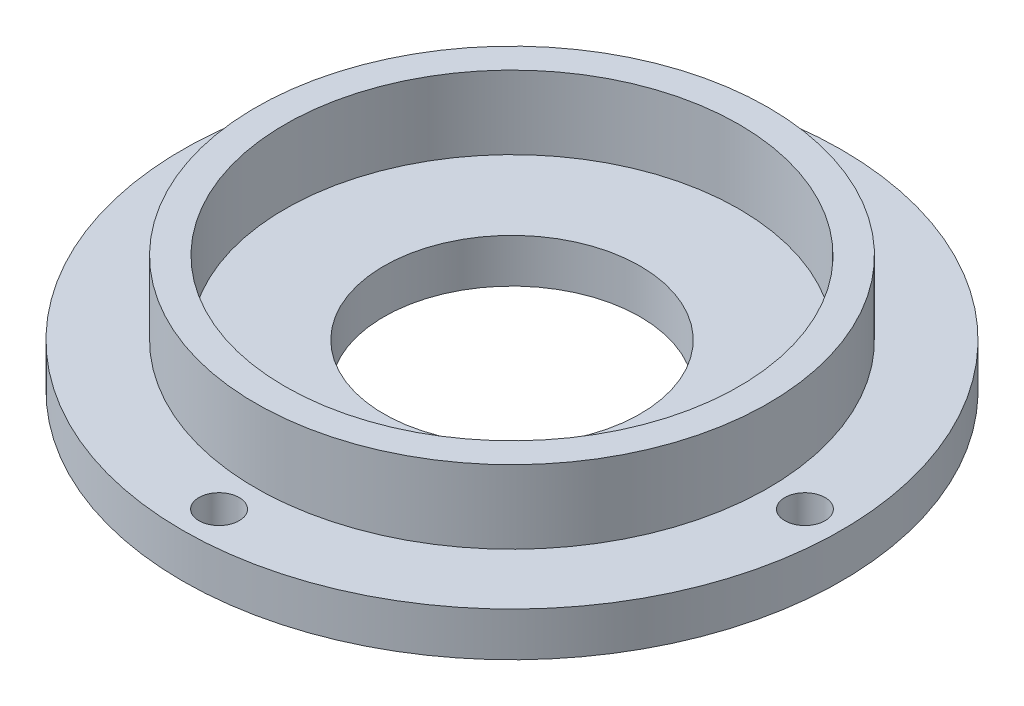
ISO-10303-21;
HEADER;
FILE_DESCRIPTION(('STEP AP214'),'2;1');
FILE_NAME('part.step','',(''),(''),'','','');
FILE_SCHEMA(('AUTOMOTIVE_DESIGN { 1 0 10303 214 1 1 1 1 }'));
ENDSEC;
DATA;
#1=APPLICATION_CONTEXT('core data for automotive mechanical design processes');
#2=APPLICATION_PROTOCOL_DEFINITION('international standard','automotive_design',2000,#1);
#3=PRODUCT_CONTEXT('',#1,'mechanical');
#4=PRODUCT('Part','Part','',(#3));
#5=PRODUCT_RELATED_PRODUCT_CATEGORY('part','',(#4));
#6=PRODUCT_DEFINITION_FORMATION('','',#4);
#7=PRODUCT_DEFINITION_CONTEXT('part definition',#1,'design');
#8=PRODUCT_DEFINITION('design','',#6,#7);
#9=PRODUCT_DEFINITION_SHAPE('','',#8);
#10=(LENGTH_UNIT() NAMED_UNIT(*) SI_UNIT(.MILLI.,.METRE.));
#11=(NAMED_UNIT(*) PLANE_ANGLE_UNIT() SI_UNIT($,.RADIAN.));
#12=(NAMED_UNIT(*) SI_UNIT($,.STERADIAN.) SOLID_ANGLE_UNIT());
#13=UNCERTAINTY_MEASURE_WITH_UNIT(LENGTH_MEASURE(1.E-05),#10,'distance_accuracy_value','');
#14=(GEOMETRIC_REPRESENTATION_CONTEXT(3) GLOBAL_UNCERTAINTY_ASSIGNED_CONTEXT((#13)) GLOBAL_UNIT_ASSIGNED_CONTEXT((#10,
#11,#12)) REPRESENTATION_CONTEXT('',''));
#15=CARTESIAN_POINT('',(0.,0.,0.));
#16=DIRECTION('',(0.,0.,1.));
#17=DIRECTION('',(1.,0.,0.));
#18=AXIS2_PLACEMENT_3D('',#15,#16,#17);
#19=CARTESIAN_POINT('',(45.,0.,0.));
#20=DIRECTION('',(0.,-1.,0.));
#21=DIRECTION('',(0.,0.,-1.));
#22=AXIS2_PLACEMENT_3D('',#19,#20,#21);
#23=PLANE('',#22);
#24=CARTESIAN_POINT('',(0.,0.,-40.));
#25=DIRECTION('',(0.,1.,0.));
#26=DIRECTION('',(0.,0.,1.));
#27=AXIS2_PLACEMENT_3D('',#24,#25,#26);
#28=CIRCLE('',#27,2.75);
#29=CARTESIAN_POINT('',(0.,0.,-37.25));
#30=VERTEX_POINT('',#29);
#31=EDGE_CURVE('E79',#30,#30,#28,.T.);
#32=ORIENTED_EDGE('',*,*,#31,.T.);
#33=EDGE_LOOP('',(#32));
#34=FACE_BOUND('',#33,.T.);
#35=CARTESIAN_POINT('',(40.,0.,0.));
#36=DIRECTION('',(0.,1.,0.));
#37=DIRECTION('',(0.,0.,1.));
#38=AXIS2_PLACEMENT_3D('',#35,#36,#37);
#39=CIRCLE('',#38,2.75);
#40=CARTESIAN_POINT('',(40.,0.,2.75));
#41=VERTEX_POINT('',#40);
#42=EDGE_CURVE('E73',#41,#41,#39,.T.);
#43=ORIENTED_EDGE('',*,*,#42,.T.);
#44=EDGE_LOOP('',(#43));
#45=FACE_BOUND('',#44,.T.);
#46=CARTESIAN_POINT('',(0.,0.,40.));
#47=DIRECTION('',(0.,1.,0.));
#48=DIRECTION('',(0.,0.,1.));
#49=AXIS2_PLACEMENT_3D('',#46,#47,#48);
#50=CIRCLE('',#49,2.75);
#51=CARTESIAN_POINT('',(0.,0.,42.75));
#52=VERTEX_POINT('',#51);
#53=EDGE_CURVE('E67',#52,#52,#50,.T.);
#54=ORIENTED_EDGE('',*,*,#53,.T.);
#55=EDGE_LOOP('',(#54));
#56=FACE_BOUND('',#55,.T.);
#57=CARTESIAN_POINT('',(-40.,0.,0.));
#58=DIRECTION('',(0.,1.,0.));
#59=DIRECTION('',(0.,0.,1.));
#60=AXIS2_PLACEMENT_3D('',#57,#58,#59);
#61=CIRCLE('',#60,2.75);
#62=CARTESIAN_POINT('',(-40.,0.,2.75));
#63=VERTEX_POINT('',#62);
#64=EDGE_CURVE('E61',#63,#63,#61,.T.);
#65=ORIENTED_EDGE('',*,*,#64,.T.);
#66=EDGE_LOOP('',(#65));
#67=FACE_BOUND('',#66,.T.);
#68=CARTESIAN_POINT('',(0.,0.,0.));
#69=DIRECTION('',(0.,-1.,0.));
#70=DIRECTION('',(0.,0.,-1.));
#71=AXIS2_PLACEMENT_3D('',#68,#69,#70);
#72=CIRCLE('',#71,45.);
#73=CARTESIAN_POINT('',(0.,0.,-45.));
#74=VERTEX_POINT('',#73);
#75=EDGE_CURVE('E58',#74,#74,#72,.T.);
#76=ORIENTED_EDGE('',*,*,#75,.T.);
#77=EDGE_LOOP('',(#76));
#78=FACE_BOUND('',#77,.T.);
#79=CARTESIAN_POINT('',(0.,0.,0.));
#80=DIRECTION('',(0.,-1.,0.));
#81=DIRECTION('',(0.,0.,-1.));
#82=AXIS2_PLACEMENT_3D('',#79,#80,#81);
#83=CIRCLE('',#82,17.5);
#84=CARTESIAN_POINT('',(0.,0.,-17.5));
#85=VERTEX_POINT('',#84);
#86=EDGE_CURVE('E10',#85,#85,#83,.T.);
#87=ORIENTED_EDGE('',*,*,#86,.F.);
#88=EDGE_LOOP('',(#87));
#89=FACE_BOUND('',#88,.T.);
#90=ADVANCED_FACE('F30',(#34,#45,#56,#67,#78,#89),#23,.T.);
#91=CARTESIAN_POINT('',(0.,0.,0.));
#92=DIRECTION('',(0.,-1.,0.));
#93=DIRECTION('',(0.,0.,-1.));
#94=AXIS2_PLACEMENT_3D('',#91,#92,#93);
#95=CYLINDRICAL_SURFACE('',#94,17.5);
#96=ORIENTED_EDGE('',*,*,#86,.T.);
#97=EDGE_LOOP('',(#96));
#98=FACE_BOUND('',#97,.T.);
#99=CARTESIAN_POINT('',(0.,6.,0.));
#100=DIRECTION('',(0.,-1.,0.));
#101=DIRECTION('',(0.,0.,-1.));
#102=AXIS2_PLACEMENT_3D('',#99,#100,#101);
#103=CIRCLE('',#102,17.5);
#104=CARTESIAN_POINT('',(0.,6.,-17.5));
#105=VERTEX_POINT('',#104);
#106=EDGE_CURVE('E36',#105,#105,#103,.T.);
#107=ORIENTED_EDGE('',*,*,#106,.F.);
#108=EDGE_LOOP('',(#107));
#109=FACE_BOUND('',#108,.T.);
#110=ADVANCED_FACE('F112',(#98,#109),#95,.F.);
#111=CARTESIAN_POINT('',(17.5,6.,0.));
#112=DIRECTION('',(0.,1.,0.));
#113=DIRECTION('',(0.,0.,1.));
#114=AXIS2_PLACEMENT_3D('',#111,#112,#113);
#115=PLANE('',#114);
#116=ORIENTED_EDGE('',*,*,#106,.T.);
#117=EDGE_LOOP('',(#116));
#118=FACE_BOUND('',#117,.T.);
#119=CARTESIAN_POINT('',(0.,6.,0.));
#120=DIRECTION('',(0.,-1.,0.));
#121=DIRECTION('',(0.,0.,-1.));
#122=AXIS2_PLACEMENT_3D('',#119,#120,#121);
#123=CIRCLE('',#122,31.);
#124=CARTESIAN_POINT('',(0.,6.,-31.));
#125=VERTEX_POINT('',#124);
#126=EDGE_CURVE('E40',#125,#125,#123,.T.);
#127=ORIENTED_EDGE('',*,*,#126,.F.);
#128=EDGE_LOOP('',(#127));
#129=FACE_BOUND('',#128,.T.);
#130=ADVANCED_FACE('F117',(#118,#129),#115,.T.);
#131=CARTESIAN_POINT('',(0.,0.,0.));
#132=DIRECTION('',(0.,-1.,0.));
#133=DIRECTION('',(0.,0.,-1.));
#134=AXIS2_PLACEMENT_3D('',#131,#132,#133);
#135=CYLINDRICAL_SURFACE('',#134,31.);
#136=ORIENTED_EDGE('',*,*,#126,.T.);
#137=EDGE_LOOP('',(#136));
#138=FACE_BOUND('',#137,.T.);
#139=CARTESIAN_POINT('',(0.,16.,0.));
#140=DIRECTION('',(0.,-1.,0.));
#141=DIRECTION('',(0.,0.,-1.));
#142=AXIS2_PLACEMENT_3D('',#139,#140,#141);
#143=CIRCLE('',#142,31.);
#144=CARTESIAN_POINT('',(0.,16.,-31.));
#145=VERTEX_POINT('',#144);
#146=EDGE_CURVE('E44',#145,#145,#143,.T.);
#147=ORIENTED_EDGE('',*,*,#146,.F.);
#148=EDGE_LOOP('',(#147));
#149=FACE_BOUND('',#148,.T.);
#150=ADVANCED_FACE('F144',(#138,#149),#135,.F.);
#151=CARTESIAN_POINT('',(31.,16.,0.));
#152=DIRECTION('',(0.,1.,0.));
#153=DIRECTION('',(0.,0.,1.));
#154=AXIS2_PLACEMENT_3D('',#151,#152,#153);
#155=PLANE('',#154);
#156=ORIENTED_EDGE('',*,*,#146,.T.);
#157=EDGE_LOOP('',(#156));
#158=FACE_BOUND('',#157,.T.);
#159=CARTESIAN_POINT('',(0.,16.,0.));
#160=DIRECTION('',(0.,-1.,0.));
#161=DIRECTION('',(0.,0.,-1.));
#162=AXIS2_PLACEMENT_3D('',#159,#160,#161);
#163=CIRCLE('',#162,35.);
#164=CARTESIAN_POINT('',(0.,16.,-35.));
#165=VERTEX_POINT('',#164);
#166=EDGE_CURVE('E49',#165,#165,#163,.T.);
#167=ORIENTED_EDGE('',*,*,#166,.F.);
#168=EDGE_LOOP('',(#167));
#169=FACE_BOUND('',#168,.T.);
#170=ADVANCED_FACE('F140',(#158,#169),#155,.T.);
#171=CARTESIAN_POINT('',(0.,0.,0.));
#172=DIRECTION('',(0.,-1.,0.));
#173=DIRECTION('',(0.,0.,-1.));
#174=AXIS2_PLACEMENT_3D('',#171,#172,#173);
#175=CYLINDRICAL_SURFACE('',#174,35.);
#176=ORIENTED_EDGE('',*,*,#166,.T.);
#177=EDGE_LOOP('',(#176));
#178=FACE_BOUND('',#177,.T.);
#179=CARTESIAN_POINT('',(0.,6.,0.));
#180=DIRECTION('',(0.,-1.,0.));
#181=DIRECTION('',(0.,0.,-1.));
#182=AXIS2_PLACEMENT_3D('',#179,#180,#181);
#183=CIRCLE('',#182,35.);
#184=CARTESIAN_POINT('',(0.,6.,-35.));
#185=VERTEX_POINT('',#184);
#186=EDGE_CURVE('E52',#185,#185,#183,.T.);
#187=ORIENTED_EDGE('',*,*,#186,.F.);
#188=EDGE_LOOP('',(#187));
#189=FACE_BOUND('',#188,.T.);
#190=ADVANCED_FACE('F92',(#178,#189),#175,.T.);
#191=CARTESIAN_POINT('',(35.,6.,0.));
#192=DIRECTION('',(0.,1.,0.));
#193=DIRECTION('',(0.,0.,1.));
#194=AXIS2_PLACEMENT_3D('',#191,#192,#193);
#195=PLANE('',#194);
#196=CARTESIAN_POINT('',(0.,6.,-40.));
#197=DIRECTION('',(0.,1.,0.));
#198=DIRECTION('',(0.,0.,1.));
#199=AXIS2_PLACEMENT_3D('',#196,#197,#198);
#200=CIRCLE('',#199,2.75);
#201=CARTESIAN_POINT('',(0.,6.,-37.25));
#202=VERTEX_POINT('',#201);
#203=EDGE_CURVE('E82',#202,#202,#200,.T.);
#204=ORIENTED_EDGE('',*,*,#203,.F.);
#205=EDGE_LOOP('',(#204));
#206=FACE_BOUND('',#205,.T.);
#207=CARTESIAN_POINT('',(40.,6.,0.));
#208=DIRECTION('',(0.,1.,0.));
#209=DIRECTION('',(0.,0.,1.));
#210=AXIS2_PLACEMENT_3D('',#207,#208,#209);
#211=CIRCLE('',#210,2.75);
#212=CARTESIAN_POINT('',(40.,6.,2.75));
#213=VERTEX_POINT('',#212);
#214=EDGE_CURVE('E76',#213,#213,#211,.T.);
#215=ORIENTED_EDGE('',*,*,#214,.F.);
#216=EDGE_LOOP('',(#215));
#217=FACE_BOUND('',#216,.T.);
#218=CARTESIAN_POINT('',(0.,6.,40.));
#219=DIRECTION('',(0.,1.,0.));
#220=DIRECTION('',(0.,0.,1.));
#221=AXIS2_PLACEMENT_3D('',#218,#219,#220);
#222=CIRCLE('',#221,2.75);
#223=CARTESIAN_POINT('',(0.,6.,42.75));
#224=VERTEX_POINT('',#223);
#225=EDGE_CURVE('E70',#224,#224,#222,.T.);
#226=ORIENTED_EDGE('',*,*,#225,.F.);
#227=EDGE_LOOP('',(#226));
#228=FACE_BOUND('',#227,.T.);
#229=CARTESIAN_POINT('',(-40.,6.,0.));
#230=DIRECTION('',(0.,1.,0.));
#231=DIRECTION('',(0.,0.,1.));
#232=AXIS2_PLACEMENT_3D('',#229,#230,#231);
#233=CIRCLE('',#232,2.75);
#234=CARTESIAN_POINT('',(-40.,6.,2.75));
#235=VERTEX_POINT('',#234);
#236=EDGE_CURVE('E64',#235,#235,#233,.T.);
#237=ORIENTED_EDGE('',*,*,#236,.F.);
#238=EDGE_LOOP('',(#237));
#239=FACE_BOUND('',#238,.T.);
#240=ORIENTED_EDGE('',*,*,#186,.T.);
#241=EDGE_LOOP('',(#240));
#242=FACE_BOUND('',#241,.T.);
#243=CARTESIAN_POINT('',(0.,6.,0.));
#244=DIRECTION('',(0.,-1.,0.));
#245=DIRECTION('',(0.,0.,-1.));
#246=AXIS2_PLACEMENT_3D('',#243,#244,#245);
#247=CIRCLE('',#246,45.);
#248=CARTESIAN_POINT('',(0.,6.,-45.));
#249=VERTEX_POINT('',#248);
#250=EDGE_CURVE('E55',#249,#249,#247,.T.);
#251=ORIENTED_EDGE('',*,*,#250,.F.);
#252=EDGE_LOOP('',(#251));
#253=FACE_BOUND('',#252,.T.);
#254=ADVANCED_FACE('F88',(#206,#217,#228,#239,#242,#253),#195,.T.);
#255=CARTESIAN_POINT('',(0.,0.,0.));
#256=DIRECTION('',(0.,-1.,0.));
#257=DIRECTION('',(0.,0.,-1.));
#258=AXIS2_PLACEMENT_3D('',#255,#256,#257);
#259=CYLINDRICAL_SURFACE('',#258,45.);
#260=ORIENTED_EDGE('',*,*,#250,.T.);
#261=EDGE_LOOP('',(#260));
#262=FACE_BOUND('',#261,.T.);
#263=ORIENTED_EDGE('',*,*,#75,.F.);
#264=EDGE_LOOP('',(#263));
#265=FACE_BOUND('',#264,.T.);
#266=ADVANCED_FACE('F91',(#262,#265),#259,.T.);
#267=CARTESIAN_POINT('',(-40.,6.,0.));
#268=DIRECTION('',(0.,1.,0.));
#269=DIRECTION('',(0.,0.,1.));
#270=AXIS2_PLACEMENT_3D('',#267,#268,#269);
#271=CYLINDRICAL_SURFACE('',#270,2.75);
#272=ORIENTED_EDGE('',*,*,#64,.F.);
#273=EDGE_LOOP('',(#272));
#274=FACE_BOUND('',#273,.T.);
#275=ORIENTED_EDGE('',*,*,#236,.T.);
#276=EDGE_LOOP('',(#275));
#277=FACE_BOUND('',#276,.T.);
#278=ADVANCED_FACE('F106',(#274,#277),#271,.F.);
#279=CARTESIAN_POINT('',(0.,6.,40.));
#280=DIRECTION('',(0.,1.,0.));
#281=DIRECTION('',(0.,0.,1.));
#282=AXIS2_PLACEMENT_3D('',#279,#280,#281);
#283=CYLINDRICAL_SURFACE('',#282,2.75);
#284=ORIENTED_EDGE('',*,*,#53,.F.);
#285=EDGE_LOOP('',(#284));
#286=FACE_BOUND('',#285,.T.);
#287=ORIENTED_EDGE('',*,*,#225,.T.);
#288=EDGE_LOOP('',(#287));
#289=FACE_BOUND('',#288,.T.);
#290=ADVANCED_FACE('F128',(#286,#289),#283,.F.);
#291=CARTESIAN_POINT('',(40.,6.,0.));
#292=DIRECTION('',(0.,1.,0.));
#293=DIRECTION('',(0.,0.,1.));
#294=AXIS2_PLACEMENT_3D('',#291,#292,#293);
#295=CYLINDRICAL_SURFACE('',#294,2.75);
#296=ORIENTED_EDGE('',*,*,#42,.F.);
#297=EDGE_LOOP('',(#296));
#298=FACE_BOUND('',#297,.T.);
#299=ORIENTED_EDGE('',*,*,#214,.T.);
#300=EDGE_LOOP('',(#299));
#301=FACE_BOUND('',#300,.T.);
#302=ADVANCED_FACE('F133',(#298,#301),#295,.F.);
#303=CARTESIAN_POINT('',(0.,6.,-40.));
#304=DIRECTION('',(0.,1.,0.));
#305=DIRECTION('',(0.,0.,1.));
#306=AXIS2_PLACEMENT_3D('',#303,#304,#305);
#307=CYLINDRICAL_SURFACE('',#306,2.75);
#308=ORIENTED_EDGE('',*,*,#31,.F.);
#309=EDGE_LOOP('',(#308));
#310=FACE_BOUND('',#309,.T.);
#311=ORIENTED_EDGE('',*,*,#203,.T.);
#312=EDGE_LOOP('',(#311));
#313=FACE_BOUND('',#312,.T.);
#314=ADVANCED_FACE('F86',(#310,#313),#307,.F.);
#315=CLOSED_SHELL('',(#90,#110,#130,#150,#170,#190,#254,#266,#278,#290,#302,#314));
#316=MANIFOLD_SOLID_BREP('B2',#315);
#317=ADVANCED_BREP_SHAPE_REPRESENTATION('',(#18,#316),#14);
#318=SHAPE_DEFINITION_REPRESENTATION(#9,#317);
ENDSEC;
END-ISO-10303-21;
